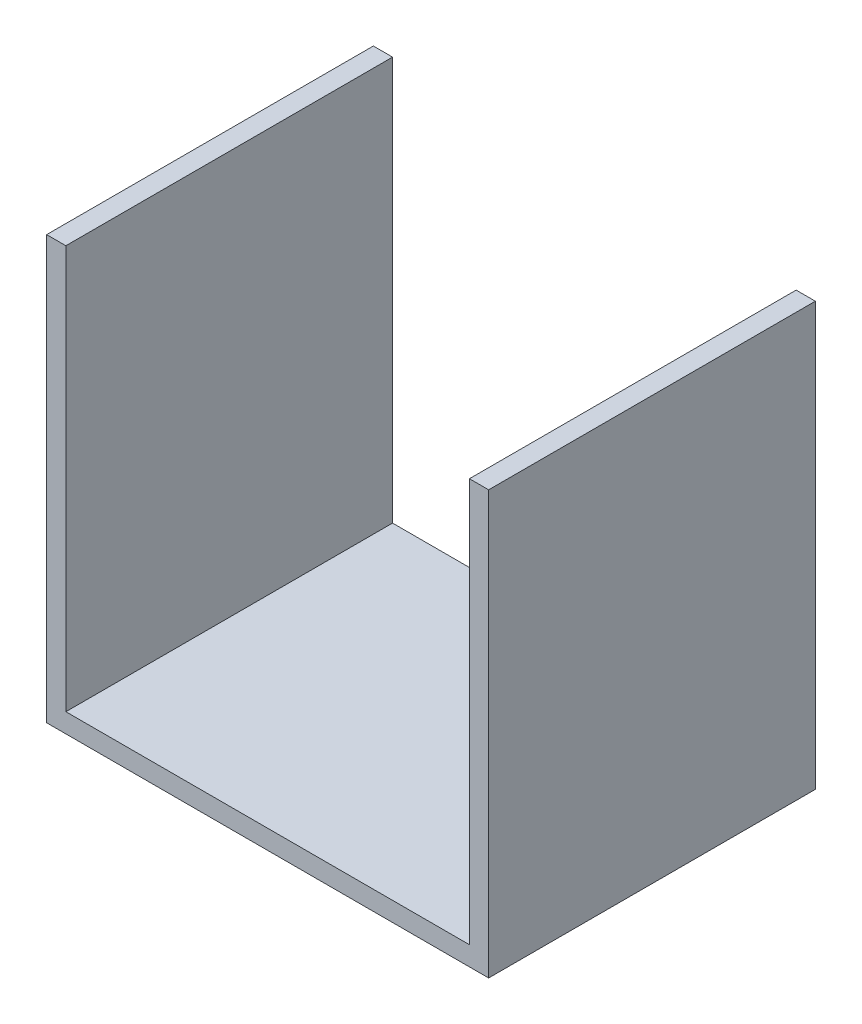
ISO-10303-21;
HEADER;
FILE_DESCRIPTION(('STEP AP214'),'2;1');
FILE_NAME('part.step','',(''),(''),'','','');
FILE_SCHEMA(('AUTOMOTIVE_DESIGN { 1 0 10303 214 1 1 1 1 }'));
ENDSEC;
DATA;
#1=APPLICATION_CONTEXT('core data for automotive mechanical design processes');
#2=APPLICATION_PROTOCOL_DEFINITION('international standard','automotive_design',2000,#1);
#3=PRODUCT_CONTEXT('',#1,'mechanical');
#4=PRODUCT('Part','Part','',(#3));
#5=PRODUCT_RELATED_PRODUCT_CATEGORY('part','',(#4));
#6=PRODUCT_DEFINITION_FORMATION('','',#4);
#7=PRODUCT_DEFINITION_CONTEXT('part definition',#1,'design');
#8=PRODUCT_DEFINITION('design','',#6,#7);
#9=PRODUCT_DEFINITION_SHAPE('','',#8);
#10=(LENGTH_UNIT() NAMED_UNIT(*) SI_UNIT(.MILLI.,.METRE.));
#11=(NAMED_UNIT(*) PLANE_ANGLE_UNIT() SI_UNIT($,.RADIAN.));
#12=(NAMED_UNIT(*) SI_UNIT($,.STERADIAN.) SOLID_ANGLE_UNIT());
#13=UNCERTAINTY_MEASURE_WITH_UNIT(LENGTH_MEASURE(1.E-05),#10,'distance_accuracy_value','');
#14=(GEOMETRIC_REPRESENTATION_CONTEXT(3) GLOBAL_UNCERTAINTY_ASSIGNED_CONTEXT((#13)) GLOBAL_UNIT_ASSIGNED_CONTEXT((#10,
#11,#12)) REPRESENTATION_CONTEXT('',''));
#15=CARTESIAN_POINT('',(0.,0.,0.));
#16=DIRECTION('',(0.,0.,1.));
#17=DIRECTION('',(1.,0.,0.));
#18=AXIS2_PLACEMENT_3D('',#15,#16,#17);
#19=CARTESIAN_POINT('',(0.,0.,34.));
#20=DIRECTION('',(-1.,0.,0.));
#21=DIRECTION('',(0.,0.,1.));
#22=AXIS2_PLACEMENT_3D('',#19,#20,#21);
#23=PLANE('',#22);
#24=DIRECTION('',(0.,1.,0.));
#25=VECTOR('',#24,1.);
#26=CARTESIAN_POINT('',(0.,0.,0.));
#27=LINE('',#26,#25);
#28=CARTESIAN_POINT('',(0.,0.,0.));
#29=VERTEX_POINT('',#28);
#30=CARTESIAN_POINT('',(0.,42.,0.));
#31=VERTEX_POINT('',#30);
#32=EDGE_CURVE('E137',#29,#31,#27,.T.);
#33=ORIENTED_EDGE('',*,*,#32,.T.);
#34=DIRECTION('',(0.,0.,-1.));
#35=VECTOR('',#34,1.);
#36=CARTESIAN_POINT('',(0.,42.,34.));
#37=LINE('',#36,#35);
#38=CARTESIAN_POINT('',(0.,42.,34.));
#39=VERTEX_POINT('',#38);
#40=EDGE_CURVE('E11',#39,#31,#37,.T.);
#41=ORIENTED_EDGE('',*,*,#40,.F.);
#42=DIRECTION('',(0.,1.,0.));
#43=VECTOR('',#42,1.);
#44=CARTESIAN_POINT('',(0.,0.,34.));
#45=LINE('',#44,#43);
#46=CARTESIAN_POINT('',(0.,0.,34.));
#47=VERTEX_POINT('',#46);
#48=EDGE_CURVE('E151',#47,#39,#45,.T.);
#49=ORIENTED_EDGE('',*,*,#48,.F.);
#50=DIRECTION('',(0.,0.,-1.));
#51=VECTOR('',#50,1.);
#52=CARTESIAN_POINT('',(0.,0.,34.));
#53=LINE('',#52,#51);
#54=EDGE_CURVE('E133',#47,#29,#53,.T.);
#55=ORIENTED_EDGE('',*,*,#54,.T.);
#56=EDGE_LOOP('',(#33,#41,#49,#55));
#57=FACE_BOUND('',#56,.T.);
#58=ADVANCED_FACE('F41',(#57),#23,.F.);
#59=CARTESIAN_POINT('',(0.,42.,34.));
#60=DIRECTION('',(0.,-1.,0.));
#61=DIRECTION('',(0.,0.,-1.));
#62=AXIS2_PLACEMENT_3D('',#59,#60,#61);
#63=PLANE('',#62);
#64=DIRECTION('',(-1.,0.,0.));
#65=VECTOR('',#64,1.);
#66=CARTESIAN_POINT('',(0.,42.,0.));
#67=LINE('',#66,#65);
#68=CARTESIAN_POINT('',(-2.,42.,0.));
#69=VERTEX_POINT('',#68);
#70=EDGE_CURVE('E140',#31,#69,#67,.T.);
#71=ORIENTED_EDGE('',*,*,#70,.T.);
#72=DIRECTION('',(0.,0.,-1.));
#73=VECTOR('',#72,1.);
#74=CARTESIAN_POINT('',(-2.,42.,34.));
#75=LINE('',#74,#73);
#76=CARTESIAN_POINT('',(-2.,42.,34.));
#77=VERTEX_POINT('',#76);
#78=EDGE_CURVE('E49',#77,#69,#75,.T.);
#79=ORIENTED_EDGE('',*,*,#78,.F.);
#80=DIRECTION('',(-1.,0.,0.));
#81=VECTOR('',#80,1.);
#82=CARTESIAN_POINT('',(0.,42.,34.));
#83=LINE('',#82,#81);
#84=EDGE_CURVE('E100',#39,#77,#83,.T.);
#85=ORIENTED_EDGE('',*,*,#84,.F.);
#86=ORIENTED_EDGE('',*,*,#40,.T.);
#87=EDGE_LOOP('',(#71,#79,#85,#86));
#88=FACE_BOUND('',#87,.T.);
#89=ADVANCED_FACE('F186',(#88),#63,.F.);
#90=CARTESIAN_POINT('',(-2.,42.,34.));
#91=DIRECTION('',(1.,0.,0.));
#92=DIRECTION('',(0.,1.,0.));
#93=AXIS2_PLACEMENT_3D('',#90,#91,#92);
#94=PLANE('',#93);
#95=DIRECTION('',(0.,-1.,0.));
#96=VECTOR('',#95,1.);
#97=CARTESIAN_POINT('',(-2.,42.,0.));
#98=LINE('',#97,#96);
#99=CARTESIAN_POINT('',(-1.99999999999999,-1.99999999999999,0.));
#100=VERTEX_POINT('',#99);
#101=EDGE_CURVE('E142',#69,#100,#98,.T.);
#102=ORIENTED_EDGE('',*,*,#101,.T.);
#103=DIRECTION('',(0.,0.,-1.));
#104=VECTOR('',#103,1.);
#105=CARTESIAN_POINT('',(-1.99999999999999,-1.99999999999999,34.));
#106=LINE('',#105,#104);
#107=CARTESIAN_POINT('',(-1.99999999999999,-1.99999999999999,34.));
#108=VERTEX_POINT('',#107);
#109=EDGE_CURVE('E158',#108,#100,#106,.T.);
#110=ORIENTED_EDGE('',*,*,#109,.F.);
#111=DIRECTION('',(0.,-1.,0.));
#112=VECTOR('',#111,1.);
#113=CARTESIAN_POINT('',(-2.,42.,34.));
#114=LINE('',#113,#112);
#115=EDGE_CURVE('E166',#77,#108,#114,.T.);
#116=ORIENTED_EDGE('',*,*,#115,.F.);
#117=ORIENTED_EDGE('',*,*,#78,.T.);
#118=EDGE_LOOP('',(#102,#110,#116,#117));
#119=FACE_BOUND('',#118,.T.);
#120=ADVANCED_FACE('F164',(#119),#94,.F.);
#121=CARTESIAN_POINT('',(-1.99999999999999,-1.99999999999999,34.));
#122=DIRECTION('',(0.,1.,0.));
#123=DIRECTION('',(-1.,0.,0.));
#124=AXIS2_PLACEMENT_3D('',#121,#122,#123);
#125=PLANE('',#124);
#126=DIRECTION('',(1.,0.,0.));
#127=VECTOR('',#126,1.);
#128=CARTESIAN_POINT('',(-1.99999999999999,-1.99999999999999,0.));
#129=LINE('',#128,#127);
#130=CARTESIAN_POINT('',(44.,-1.99999999999999,0.));
#131=VERTEX_POINT('',#130);
#132=EDGE_CURVE('E144',#100,#131,#129,.T.);
#133=ORIENTED_EDGE('',*,*,#132,.T.);
#134=DIRECTION('',(0.,0.,-1.));
#135=VECTOR('',#134,1.);
#136=CARTESIAN_POINT('',(44.,-1.99999999999999,34.));
#137=LINE('',#136,#135);
#138=CARTESIAN_POINT('',(44.,-1.99999999999999,34.));
#139=VERTEX_POINT('',#138);
#140=EDGE_CURVE('E155',#139,#131,#137,.T.);
#141=ORIENTED_EDGE('',*,*,#140,.F.);
#142=DIRECTION('',(1.,0.,0.));
#143=VECTOR('',#142,1.);
#144=CARTESIAN_POINT('',(-1.99999999999999,-1.99999999999999,34.));
#145=LINE('',#144,#143);
#146=EDGE_CURVE('E178',#108,#139,#145,.T.);
#147=ORIENTED_EDGE('',*,*,#146,.F.);
#148=ORIENTED_EDGE('',*,*,#109,.T.);
#149=EDGE_LOOP('',(#133,#141,#147,#148));
#150=FACE_BOUND('',#149,.T.);
#151=ADVANCED_FACE('F174',(#150),#125,.F.);
#152=CARTESIAN_POINT('',(44.,-1.99999999999999,34.));
#153=DIRECTION('',(-1.,0.,0.));
#154=DIRECTION('',(0.,0.,1.));
#155=AXIS2_PLACEMENT_3D('',#152,#153,#154);
#156=PLANE('',#155);
#157=DIRECTION('',(0.,1.,0.));
#158=VECTOR('',#157,1.);
#159=CARTESIAN_POINT('',(44.,-1.99999999999999,0.));
#160=LINE('',#159,#158);
#161=CARTESIAN_POINT('',(44.,42.,0.));
#162=VERTEX_POINT('',#161);
#163=EDGE_CURVE('E146',#131,#162,#160,.T.);
#164=ORIENTED_EDGE('',*,*,#163,.T.);
#165=DIRECTION('',(0.,0.,-1.));
#166=VECTOR('',#165,1.);
#167=CARTESIAN_POINT('',(44.,42.,34.));
#168=LINE('',#167,#166);
#169=CARTESIAN_POINT('',(44.,42.,34.));
#170=VERTEX_POINT('',#169);
#171=EDGE_CURVE('E128',#170,#162,#168,.T.);
#172=ORIENTED_EDGE('',*,*,#171,.F.);
#173=DIRECTION('',(0.,1.,0.));
#174=VECTOR('',#173,1.);
#175=CARTESIAN_POINT('',(44.,-1.99999999999999,34.));
#176=LINE('',#175,#174);
#177=EDGE_CURVE('E119',#139,#170,#176,.T.);
#178=ORIENTED_EDGE('',*,*,#177,.F.);
#179=ORIENTED_EDGE('',*,*,#140,.T.);
#180=EDGE_LOOP('',(#164,#172,#178,#179));
#181=FACE_BOUND('',#180,.T.);
#182=ADVANCED_FACE('F177',(#181),#156,.F.);
#183=CARTESIAN_POINT('',(44.,42.,34.));
#184=DIRECTION('',(0.,-1.,0.));
#185=DIRECTION('',(1.,0.,0.));
#186=AXIS2_PLACEMENT_3D('',#183,#184,#185);
#187=PLANE('',#186);
#188=DIRECTION('',(-1.,0.,0.));
#189=VECTOR('',#188,1.);
#190=CARTESIAN_POINT('',(44.,42.,0.));
#191=LINE('',#190,#189);
#192=CARTESIAN_POINT('',(42.,42.,0.));
#193=VERTEX_POINT('',#192);
#194=EDGE_CURVE('E127',#162,#193,#191,.T.);
#195=ORIENTED_EDGE('',*,*,#194,.T.);
#196=DIRECTION('',(0.,0.,-1.));
#197=VECTOR('',#196,1.);
#198=CARTESIAN_POINT('',(42.,42.,34.));
#199=LINE('',#198,#197);
#200=CARTESIAN_POINT('',(42.,42.,34.));
#201=VERTEX_POINT('',#200);
#202=EDGE_CURVE('E124',#201,#193,#199,.T.);
#203=ORIENTED_EDGE('',*,*,#202,.F.);
#204=DIRECTION('',(-1.,0.,0.));
#205=VECTOR('',#204,1.);
#206=CARTESIAN_POINT('',(44.,42.,34.));
#207=LINE('',#206,#205);
#208=EDGE_CURVE('E113',#170,#201,#207,.T.);
#209=ORIENTED_EDGE('',*,*,#208,.F.);
#210=ORIENTED_EDGE('',*,*,#171,.T.);
#211=EDGE_LOOP('',(#195,#203,#209,#210));
#212=FACE_BOUND('',#211,.T.);
#213=ADVANCED_FACE('F125',(#212),#187,.F.);
#214=CARTESIAN_POINT('',(42.,0.,34.));
#215=DIRECTION('',(1.,0.,0.));
#216=DIRECTION('',(0.,0.,-1.));
#217=AXIS2_PLACEMENT_3D('',#214,#215,#216);
#218=PLANE('',#217);
#219=DIRECTION('',(0.,-1.,0.));
#220=VECTOR('',#219,1.);
#221=CARTESIAN_POINT('',(42.,0.,0.));
#222=LINE('',#221,#220);
#223=CARTESIAN_POINT('',(42.,0.,0.));
#224=VERTEX_POINT('',#223);
#225=EDGE_CURVE('E86',#193,#224,#222,.T.);
#226=ORIENTED_EDGE('',*,*,#225,.T.);
#227=DIRECTION('',(0.,0.,-1.));
#228=VECTOR('',#227,1.);
#229=CARTESIAN_POINT('',(42.,0.,34.));
#230=LINE('',#229,#228);
#231=CARTESIAN_POINT('',(42.,0.,34.));
#232=VERTEX_POINT('',#231);
#233=EDGE_CURVE('E129',#232,#224,#230,.T.);
#234=ORIENTED_EDGE('',*,*,#233,.F.);
#235=DIRECTION('',(0.,-1.,0.));
#236=VECTOR('',#235,1.);
#237=CARTESIAN_POINT('',(42.,0.,34.));
#238=LINE('',#237,#236);
#239=EDGE_CURVE('E117',#201,#232,#238,.T.);
#240=ORIENTED_EDGE('',*,*,#239,.F.);
#241=ORIENTED_EDGE('',*,*,#202,.T.);
#242=EDGE_LOOP('',(#226,#234,#240,#241));
#243=FACE_BOUND('',#242,.T.);
#244=ADVANCED_FACE('F131',(#243),#218,.F.);
#245=CARTESIAN_POINT('',(0.,0.,34.));
#246=DIRECTION('',(0.,-1.,0.));
#247=DIRECTION('',(0.,0.,-1.));
#248=AXIS2_PLACEMENT_3D('',#245,#246,#247);
#249=PLANE('',#248);
#250=DIRECTION('',(-1.,0.,0.));
#251=VECTOR('',#250,1.);
#252=CARTESIAN_POINT('',(0.,0.,0.));
#253=LINE('',#252,#251);
#254=EDGE_CURVE('E92',#224,#29,#253,.T.);
#255=ORIENTED_EDGE('',*,*,#254,.T.);
#256=ORIENTED_EDGE('',*,*,#54,.F.);
#257=DIRECTION('',(-1.,0.,0.));
#258=VECTOR('',#257,1.);
#259=CARTESIAN_POINT('',(0.,0.,34.));
#260=LINE('',#259,#258);
#261=EDGE_CURVE('E57',#232,#47,#260,.T.);
#262=ORIENTED_EDGE('',*,*,#261,.F.);
#263=ORIENTED_EDGE('',*,*,#233,.T.);
#264=EDGE_LOOP('',(#255,#256,#262,#263));
#265=FACE_BOUND('',#264,.T.);
#266=ADVANCED_FACE('F202',(#265),#249,.F.);
#267=CARTESIAN_POINT('',(0.,0.,34.));
#268=DIRECTION('',(0.,0.,1.));
#269=DIRECTION('',(1.,0.,0.));
#270=AXIS2_PLACEMENT_3D('',#267,#268,#269);
#271=PLANE('',#270);
#272=ORIENTED_EDGE('',*,*,#48,.T.);
#273=ORIENTED_EDGE('',*,*,#84,.T.);
#274=ORIENTED_EDGE('',*,*,#115,.T.);
#275=ORIENTED_EDGE('',*,*,#146,.T.);
#276=ORIENTED_EDGE('',*,*,#177,.T.);
#277=ORIENTED_EDGE('',*,*,#208,.T.);
#278=ORIENTED_EDGE('',*,*,#239,.T.);
#279=ORIENTED_EDGE('',*,*,#261,.T.);
#280=EDGE_LOOP('',(#272,#273,#274,#275,#276,#277,#278,#279));
#281=FACE_BOUND('',#280,.T.);
#282=ADVANCED_FACE('F115',(#281),#271,.T.);
#283=CARTESIAN_POINT('',(0.,0.,0.));
#284=DIRECTION('',(0.,0.,1.));
#285=DIRECTION('',(1.,0.,0.));
#286=AXIS2_PLACEMENT_3D('',#283,#284,#285);
#287=PLANE('',#286);
#288=ORIENTED_EDGE('',*,*,#32,.F.);
#289=ORIENTED_EDGE('',*,*,#254,.F.);
#290=ORIENTED_EDGE('',*,*,#225,.F.);
#291=ORIENTED_EDGE('',*,*,#194,.F.);
#292=ORIENTED_EDGE('',*,*,#163,.F.);
#293=ORIENTED_EDGE('',*,*,#132,.F.);
#294=ORIENTED_EDGE('',*,*,#101,.F.);
#295=ORIENTED_EDGE('',*,*,#70,.F.);
#296=EDGE_LOOP('',(#288,#289,#290,#291,#292,#293,#294,#295));
#297=FACE_BOUND('',#296,.T.);
#298=ADVANCED_FACE('F170',(#297),#287,.F.);
#299=CLOSED_SHELL('',(#58,#89,#120,#151,#182,#213,#244,#266,#282,#298));
#300=MANIFOLD_SOLID_BREP('B2',#299);
#301=ADVANCED_BREP_SHAPE_REPRESENTATION('',(#18,#300),#14);
#302=SHAPE_DEFINITION_REPRESENTATION(#9,#301);
ENDSEC;
END-ISO-10303-21;
